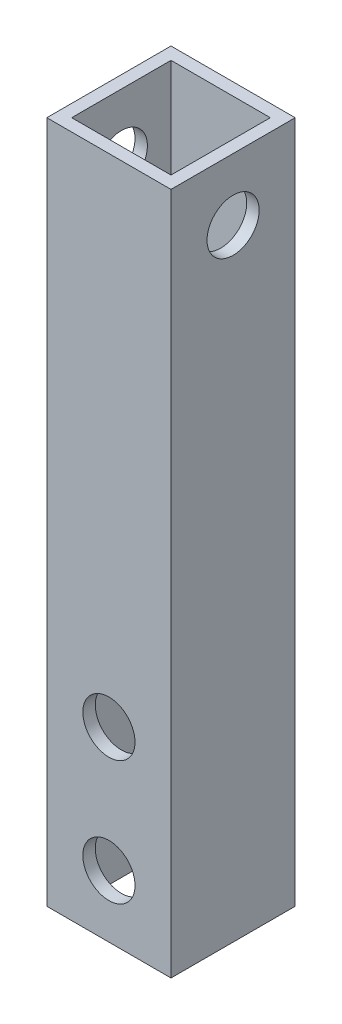
ISO-10303-21;
HEADER;
FILE_DESCRIPTION(('STEP AP214'),'2;1');
FILE_NAME('part.step','',(''),(''),'','','');
FILE_SCHEMA(('AUTOMOTIVE_DESIGN { 1 0 10303 214 1 1 1 1 }'));
ENDSEC;
DATA;
#1=APPLICATION_CONTEXT('core data for automotive mechanical design processes');
#2=APPLICATION_PROTOCOL_DEFINITION('international standard','automotive_design',2000,#1);
#3=PRODUCT_CONTEXT('',#1,'mechanical');
#4=PRODUCT('Part','Part','',(#3));
#5=PRODUCT_RELATED_PRODUCT_CATEGORY('part','',(#4));
#6=PRODUCT_DEFINITION_FORMATION('','',#4);
#7=PRODUCT_DEFINITION_CONTEXT('part definition',#1,'design');
#8=PRODUCT_DEFINITION('design','',#6,#7);
#9=PRODUCT_DEFINITION_SHAPE('','',#8);
#10=(LENGTH_UNIT() NAMED_UNIT(*) SI_UNIT(.MILLI.,.METRE.));
#11=(NAMED_UNIT(*) PLANE_ANGLE_UNIT() SI_UNIT($,.RADIAN.));
#12=(NAMED_UNIT(*) SI_UNIT($,.STERADIAN.) SOLID_ANGLE_UNIT());
#13=UNCERTAINTY_MEASURE_WITH_UNIT(LENGTH_MEASURE(1.E-05),#10,'distance_accuracy_value','');
#14=(GEOMETRIC_REPRESENTATION_CONTEXT(3) GLOBAL_UNCERTAINTY_ASSIGNED_CONTEXT((#13)) GLOBAL_UNIT_ASSIGNED_CONTEXT((#10,
#11,#12)) REPRESENTATION_CONTEXT('',''));
#15=CARTESIAN_POINT('',(0.,0.,0.));
#16=DIRECTION('',(0.,0.,1.));
#17=DIRECTION('',(1.,0.,0.));
#18=AXIS2_PLACEMENT_3D('',#15,#16,#17);
#19=CARTESIAN_POINT('',(0.,55.,0.));
#20=DIRECTION('',(0.,1.,0.));
#21=DIRECTION('',(0.,0.,1.));
#22=AXIS2_PLACEMENT_3D('',#19,#20,#21);
#23=PLANE('',#22);
#24=DIRECTION('',(0.,0.,-1.));
#25=VECTOR('',#24,1.);
#26=CARTESIAN_POINT('',(5.,55.,-5.));
#27=LINE('',#26,#25);
#28=CARTESIAN_POINT('',(5.,55.,5.));
#29=VERTEX_POINT('',#28);
#30=CARTESIAN_POINT('',(5.,55.,-5.));
#31=VERTEX_POINT('',#30);
#32=EDGE_CURVE('E164',#29,#31,#27,.T.);
#33=ORIENTED_EDGE('',*,*,#32,.T.);
#34=DIRECTION('',(-1.,0.,0.));
#35=VECTOR('',#34,1.);
#36=CARTESIAN_POINT('',(-5.,55.,-5.));
#37=LINE('',#36,#35);
#38=CARTESIAN_POINT('',(-5.,55.,-5.));
#39=VERTEX_POINT('',#38);
#40=EDGE_CURVE('E167',#31,#39,#37,.T.);
#41=ORIENTED_EDGE('',*,*,#40,.T.);
#42=DIRECTION('',(0.,0.,1.));
#43=VECTOR('',#42,1.);
#44=CARTESIAN_POINT('',(-5.,55.,-5.));
#45=LINE('',#44,#43);
#46=CARTESIAN_POINT('',(-5.,55.,5.));
#47=VERTEX_POINT('',#46);
#48=EDGE_CURVE('E170',#39,#47,#45,.T.);
#49=ORIENTED_EDGE('',*,*,#48,.T.);
#50=DIRECTION('',(1.,0.,0.));
#51=VECTOR('',#50,1.);
#52=CARTESIAN_POINT('',(-5.,55.,5.));
#53=LINE('',#52,#51);
#54=EDGE_CURVE('E172',#47,#29,#53,.T.);
#55=ORIENTED_EDGE('',*,*,#54,.T.);
#56=EDGE_LOOP('',(#33,#41,#49,#55));
#57=FACE_BOUND('',#56,.T.);
#58=DIRECTION('',(-1.,0.,0.));
#59=VECTOR('',#58,1.);
#60=CARTESIAN_POINT('',(-5.,55.,-4.));
#61=LINE('',#60,#59);
#62=CARTESIAN_POINT('',(4.,55.,-4.));
#63=VERTEX_POINT('',#62);
#64=CARTESIAN_POINT('',(-4.,55.,-4.));
#65=VERTEX_POINT('',#64);
#66=EDGE_CURVE('E134',#63,#65,#61,.T.);
#67=ORIENTED_EDGE('',*,*,#66,.F.);
#68=DIRECTION('',(0.,0.,-1.));
#69=VECTOR('',#68,1.);
#70=CARTESIAN_POINT('',(4.,55.,-5.));
#71=LINE('',#70,#69);
#72=CARTESIAN_POINT('',(4.,55.,4.));
#73=VERTEX_POINT('',#72);
#74=EDGE_CURVE('E126',#73,#63,#71,.T.);
#75=ORIENTED_EDGE('',*,*,#74,.F.);
#76=DIRECTION('',(1.,0.,0.));
#77=VECTOR('',#76,1.);
#78=CARTESIAN_POINT('',(-5.,55.,4.));
#79=LINE('',#78,#77);
#80=CARTESIAN_POINT('',(-4.,55.,4.));
#81=VERTEX_POINT('',#80);
#82=EDGE_CURVE('E148',#81,#73,#79,.T.);
#83=ORIENTED_EDGE('',*,*,#82,.F.);
#84=DIRECTION('',(0.,0.,1.));
#85=VECTOR('',#84,1.);
#86=CARTESIAN_POINT('',(-4.,55.,-5.));
#87=LINE('',#86,#85);
#88=EDGE_CURVE('E146',#65,#81,#87,.T.);
#89=ORIENTED_EDGE('',*,*,#88,.F.);
#90=EDGE_LOOP('',(#67,#75,#83,#89));
#91=FACE_BOUND('',#90,.T.);
#92=ADVANCED_FACE('F59',(#57,#91),#23,.T.);
#93=CARTESIAN_POINT('',(0.,0.,0.));
#94=DIRECTION('',(0.,1.,0.));
#95=DIRECTION('',(0.,0.,1.));
#96=AXIS2_PLACEMENT_3D('',#93,#94,#95);
#97=PLANE('',#96);
#98=DIRECTION('',(0.,0.,-1.));
#99=VECTOR('',#98,1.);
#100=CARTESIAN_POINT('',(5.,0.,-5.));
#101=LINE('',#100,#99);
#102=CARTESIAN_POINT('',(5.,0.,5.));
#103=VERTEX_POINT('',#102);
#104=CARTESIAN_POINT('',(5.,0.,-5.));
#105=VERTEX_POINT('',#104);
#106=EDGE_CURVE('E142',#103,#105,#101,.T.);
#107=ORIENTED_EDGE('',*,*,#106,.F.);
#108=DIRECTION('',(1.,0.,0.));
#109=VECTOR('',#108,1.);
#110=CARTESIAN_POINT('',(-5.,0.,5.));
#111=LINE('',#110,#109);
#112=CARTESIAN_POINT('',(-5.,0.,5.));
#113=VERTEX_POINT('',#112);
#114=EDGE_CURVE('E168',#113,#103,#111,.T.);
#115=ORIENTED_EDGE('',*,*,#114,.F.);
#116=DIRECTION('',(0.,0.,1.));
#117=VECTOR('',#116,1.);
#118=CARTESIAN_POINT('',(-5.,0.,-5.));
#119=LINE('',#118,#117);
#120=CARTESIAN_POINT('',(-5.,0.,-5.));
#121=VERTEX_POINT('',#120);
#122=EDGE_CURVE('E179',#121,#113,#119,.T.);
#123=ORIENTED_EDGE('',*,*,#122,.F.);
#124=DIRECTION('',(-1.,0.,0.));
#125=VECTOR('',#124,1.);
#126=CARTESIAN_POINT('',(-5.,0.,-5.));
#127=LINE('',#126,#125);
#128=EDGE_CURVE('E177',#105,#121,#127,.T.);
#129=ORIENTED_EDGE('',*,*,#128,.F.);
#130=EDGE_LOOP('',(#107,#115,#123,#129));
#131=FACE_BOUND('',#130,.T.);
#132=DIRECTION('',(0.,0.,-1.));
#133=VECTOR('',#132,1.);
#134=CARTESIAN_POINT('',(4.,0.,-5.));
#135=LINE('',#134,#133);
#136=CARTESIAN_POINT('',(4.,0.,4.));
#137=VERTEX_POINT('',#136);
#138=CARTESIAN_POINT('',(4.,0.,-4.));
#139=VERTEX_POINT('',#138);
#140=EDGE_CURVE('E84',#137,#139,#135,.T.);
#141=ORIENTED_EDGE('',*,*,#140,.T.);
#142=DIRECTION('',(-1.,0.,0.));
#143=VECTOR('',#142,1.);
#144=CARTESIAN_POINT('',(-5.,0.,-4.));
#145=LINE('',#144,#143);
#146=CARTESIAN_POINT('',(-4.,0.,-4.));
#147=VERTEX_POINT('',#146);
#148=EDGE_CURVE('E141',#139,#147,#145,.T.);
#149=ORIENTED_EDGE('',*,*,#148,.T.);
#150=DIRECTION('',(0.,0.,1.));
#151=VECTOR('',#150,1.);
#152=CARTESIAN_POINT('',(-4.,0.,-5.));
#153=LINE('',#152,#151);
#154=CARTESIAN_POINT('',(-4.,0.,4.));
#155=VERTEX_POINT('',#154);
#156=EDGE_CURVE('E156',#147,#155,#153,.T.);
#157=ORIENTED_EDGE('',*,*,#156,.T.);
#158=DIRECTION('',(1.,0.,0.));
#159=VECTOR('',#158,1.);
#160=CARTESIAN_POINT('',(-5.,0.,4.));
#161=LINE('',#160,#159);
#162=EDGE_CURVE('E135',#155,#137,#161,.T.);
#163=ORIENTED_EDGE('',*,*,#162,.T.);
#164=EDGE_LOOP('',(#141,#149,#157,#163));
#165=FACE_BOUND('',#164,.T.);
#166=ADVANCED_FACE('F237',(#131,#165),#97,.F.);
#167=CARTESIAN_POINT('',(5.,55.,-5.));
#168=DIRECTION('',(-1.,0.,0.));
#169=DIRECTION('',(0.,0.,1.));
#170=AXIS2_PLACEMENT_3D('',#167,#168,#169);
#171=PLANE('',#170);
#172=CARTESIAN_POINT('',(5.,50.,0.));
#173=DIRECTION('',(1.,0.,0.));
#174=DIRECTION('',(0.,0.,-1.));
#175=AXIS2_PLACEMENT_3D('',#172,#173,#174);
#176=CIRCLE('',#175,2.1);
#177=CARTESIAN_POINT('',(5.,50.,-2.1));
#178=VERTEX_POINT('',#177);
#179=EDGE_CURVE('E217',#178,#178,#176,.T.);
#180=ORIENTED_EDGE('',*,*,#179,.F.);
#181=EDGE_LOOP('',(#180));
#182=FACE_BOUND('',#181,.T.);
#183=ORIENTED_EDGE('',*,*,#106,.T.);
#184=DIRECTION('',(0.,-1.,0.));
#185=VECTOR('',#184,1.);
#186=CARTESIAN_POINT('',(5.,55.,-5.));
#187=LINE('',#186,#185);
#188=EDGE_CURVE('E12',#31,#105,#187,.T.);
#189=ORIENTED_EDGE('',*,*,#188,.F.);
#190=ORIENTED_EDGE('',*,*,#32,.F.);
#191=DIRECTION('',(0.,-1.,0.));
#192=VECTOR('',#191,1.);
#193=CARTESIAN_POINT('',(5.,55.,5.));
#194=LINE('',#193,#192);
#195=EDGE_CURVE('E174',#29,#103,#194,.T.);
#196=ORIENTED_EDGE('',*,*,#195,.T.);
#197=EDGE_LOOP('',(#183,#189,#190,#196));
#198=FACE_BOUND('',#197,.T.);
#199=ADVANCED_FACE('F61',(#182,#198),#171,.F.);
#200=CARTESIAN_POINT('',(-5.,55.,-5.));
#201=DIRECTION('',(0.,0.,1.));
#202=DIRECTION('',(1.,0.,0.));
#203=AXIS2_PLACEMENT_3D('',#200,#201,#202);
#204=PLANE('',#203);
#205=CARTESIAN_POINT('',(0.,15.,-5.));
#206=DIRECTION('',(0.,0.,1.));
#207=DIRECTION('',(1.,0.,0.));
#208=AXIS2_PLACEMENT_3D('',#205,#206,#207);
#209=CIRCLE('',#208,2.1);
#210=CARTESIAN_POINT('',(2.1,15.,-5.));
#211=VERTEX_POINT('',#210);
#212=EDGE_CURVE('E192',#211,#211,#209,.T.);
#213=ORIENTED_EDGE('',*,*,#212,.T.);
#214=EDGE_LOOP('',(#213));
#215=FACE_BOUND('',#214,.T.);
#216=CARTESIAN_POINT('',(0.,5.,-5.));
#217=DIRECTION('',(0.,0.,1.));
#218=DIRECTION('',(1.,0.,0.));
#219=AXIS2_PLACEMENT_3D('',#216,#217,#218);
#220=CIRCLE('',#219,2.1);
#221=CARTESIAN_POINT('',(2.1,5.,-5.));
#222=VERTEX_POINT('',#221);
#223=EDGE_CURVE('E206',#222,#222,#220,.T.);
#224=ORIENTED_EDGE('',*,*,#223,.T.);
#225=EDGE_LOOP('',(#224));
#226=FACE_BOUND('',#225,.T.);
#227=ORIENTED_EDGE('',*,*,#128,.T.);
#228=DIRECTION('',(0.,-1.,0.));
#229=VECTOR('',#228,1.);
#230=CARTESIAN_POINT('',(-5.,55.,-5.));
#231=LINE('',#230,#229);
#232=EDGE_CURVE('E68',#39,#121,#231,.T.);
#233=ORIENTED_EDGE('',*,*,#232,.F.);
#234=ORIENTED_EDGE('',*,*,#40,.F.);
#235=ORIENTED_EDGE('',*,*,#188,.T.);
#236=EDGE_LOOP('',(#227,#233,#234,#235));
#237=FACE_BOUND('',#236,.T.);
#238=ADVANCED_FACE('F267',(#215,#226,#237),#204,.F.);
#239=CARTESIAN_POINT('',(-5.,55.,-5.));
#240=DIRECTION('',(1.,0.,0.));
#241=DIRECTION('',(0.,0.,-1.));
#242=AXIS2_PLACEMENT_3D('',#239,#240,#241);
#243=PLANE('',#242);
#244=CARTESIAN_POINT('',(-5.,50.,0.));
#245=DIRECTION('',(1.,0.,0.));
#246=DIRECTION('',(0.,0.,-1.));
#247=AXIS2_PLACEMENT_3D('',#244,#245,#246);
#248=CIRCLE('',#247,2.1);
#249=CARTESIAN_POINT('',(-5.,50.,-2.1));
#250=VERTEX_POINT('',#249);
#251=EDGE_CURVE('E220',#250,#250,#248,.T.);
#252=ORIENTED_EDGE('',*,*,#251,.T.);
#253=EDGE_LOOP('',(#252));
#254=FACE_BOUND('',#253,.T.);
#255=ORIENTED_EDGE('',*,*,#122,.T.);
#256=DIRECTION('',(0.,-1.,0.));
#257=VECTOR('',#256,1.);
#258=CARTESIAN_POINT('',(-5.,55.,5.));
#259=LINE('',#258,#257);
#260=EDGE_CURVE('E184',#47,#113,#259,.T.);
#261=ORIENTED_EDGE('',*,*,#260,.F.);
#262=ORIENTED_EDGE('',*,*,#48,.F.);
#263=ORIENTED_EDGE('',*,*,#232,.T.);
#264=EDGE_LOOP('',(#255,#261,#262,#263));
#265=FACE_BOUND('',#264,.T.);
#266=ADVANCED_FACE('F264',(#254,#265),#243,.F.);
#267=CARTESIAN_POINT('',(-5.,55.,5.));
#268=DIRECTION('',(0.,0.,-1.));
#269=DIRECTION('',(-1.,0.,0.));
#270=AXIS2_PLACEMENT_3D('',#267,#268,#269);
#271=PLANE('',#270);
#272=CARTESIAN_POINT('',(0.,15.,5.));
#273=DIRECTION('',(0.,0.,1.));
#274=DIRECTION('',(1.,0.,0.));
#275=AXIS2_PLACEMENT_3D('',#272,#273,#274);
#276=CIRCLE('',#275,2.1);
#277=CARTESIAN_POINT('',(2.1,15.,5.));
#278=VERTEX_POINT('',#277);
#279=EDGE_CURVE('E210',#278,#278,#276,.T.);
#280=ORIENTED_EDGE('',*,*,#279,.F.);
#281=EDGE_LOOP('',(#280));
#282=FACE_BOUND('',#281,.T.);
#283=CARTESIAN_POINT('',(0.,5.,5.));
#284=DIRECTION('',(0.,0.,1.));
#285=DIRECTION('',(1.,0.,0.));
#286=AXIS2_PLACEMENT_3D('',#283,#284,#285);
#287=CIRCLE('',#286,2.1);
#288=CARTESIAN_POINT('',(2.1,5.,5.));
#289=VERTEX_POINT('',#288);
#290=EDGE_CURVE('E203',#289,#289,#287,.T.);
#291=ORIENTED_EDGE('',*,*,#290,.F.);
#292=EDGE_LOOP('',(#291));
#293=FACE_BOUND('',#292,.T.);
#294=ORIENTED_EDGE('',*,*,#114,.T.);
#295=ORIENTED_EDGE('',*,*,#195,.F.);
#296=ORIENTED_EDGE('',*,*,#54,.F.);
#297=ORIENTED_EDGE('',*,*,#260,.T.);
#298=EDGE_LOOP('',(#294,#295,#296,#297));
#299=FACE_BOUND('',#298,.T.);
#300=ADVANCED_FACE('F261',(#282,#293,#299),#271,.F.);
#301=CARTESIAN_POINT('',(4.,55.,-5.));
#302=DIRECTION('',(-1.,0.,0.));
#303=DIRECTION('',(0.,0.,1.));
#304=AXIS2_PLACEMENT_3D('',#301,#302,#303);
#305=PLANE('',#304);
#306=CARTESIAN_POINT('',(4.,50.,0.));
#307=DIRECTION('',(-1.,0.,0.));
#308=DIRECTION('',(0.,0.,1.));
#309=AXIS2_PLACEMENT_3D('',#306,#307,#308);
#310=CIRCLE('',#309,2.1);
#311=CARTESIAN_POINT('',(4.,50.,2.1));
#312=VERTEX_POINT('',#311);
#313=EDGE_CURVE('E207',#312,#312,#310,.T.);
#314=ORIENTED_EDGE('',*,*,#313,.F.);
#315=EDGE_LOOP('',(#314));
#316=FACE_BOUND('',#315,.T.);
#317=ORIENTED_EDGE('',*,*,#140,.F.);
#318=DIRECTION('',(0.,-1.,0.));
#319=VECTOR('',#318,1.);
#320=CARTESIAN_POINT('',(4.,55.,4.));
#321=LINE('',#320,#319);
#322=EDGE_CURVE('E130',#73,#137,#321,.T.);
#323=ORIENTED_EDGE('',*,*,#322,.F.);
#324=ORIENTED_EDGE('',*,*,#74,.T.);
#325=DIRECTION('',(0.,-1.,0.));
#326=VECTOR('',#325,1.);
#327=CARTESIAN_POINT('',(4.,55.,-4.));
#328=LINE('',#327,#326);
#329=EDGE_CURVE('E129',#63,#139,#328,.T.);
#330=ORIENTED_EDGE('',*,*,#329,.T.);
#331=EDGE_LOOP('',(#317,#323,#324,#330));
#332=FACE_BOUND('',#331,.T.);
#333=ADVANCED_FACE('F128',(#316,#332),#305,.T.);
#334=CARTESIAN_POINT('',(-5.,55.,-4.));
#335=DIRECTION('',(0.,0.,1.));
#336=DIRECTION('',(1.,0.,0.));
#337=AXIS2_PLACEMENT_3D('',#334,#335,#336);
#338=PLANE('',#337);
#339=CARTESIAN_POINT('',(0.,15.,-4.));
#340=DIRECTION('',(0.,0.,1.));
#341=DIRECTION('',(1.,0.,0.));
#342=AXIS2_PLACEMENT_3D('',#339,#340,#341);
#343=CIRCLE('',#342,2.1);
#344=CARTESIAN_POINT('',(2.1,15.,-4.));
#345=VERTEX_POINT('',#344);
#346=EDGE_CURVE('E154',#345,#345,#343,.T.);
#347=ORIENTED_EDGE('',*,*,#346,.F.);
#348=EDGE_LOOP('',(#347));
#349=FACE_BOUND('',#348,.T.);
#350=CARTESIAN_POINT('',(0.,5.,-4.));
#351=DIRECTION('',(0.,0.,1.));
#352=DIRECTION('',(1.,0.,0.));
#353=AXIS2_PLACEMENT_3D('',#350,#351,#352);
#354=CIRCLE('',#353,2.1);
#355=CARTESIAN_POINT('',(2.1,5.,-4.));
#356=VERTEX_POINT('',#355);
#357=EDGE_CURVE('E191',#356,#356,#354,.T.);
#358=ORIENTED_EDGE('',*,*,#357,.F.);
#359=EDGE_LOOP('',(#358));
#360=FACE_BOUND('',#359,.T.);
#361=ORIENTED_EDGE('',*,*,#148,.F.);
#362=ORIENTED_EDGE('',*,*,#329,.F.);
#363=ORIENTED_EDGE('',*,*,#66,.T.);
#364=DIRECTION('',(0.,-1.,0.));
#365=VECTOR('',#364,1.);
#366=CARTESIAN_POINT('',(-4.,55.,-4.));
#367=LINE('',#366,#365);
#368=EDGE_CURVE('E143',#65,#147,#367,.T.);
#369=ORIENTED_EDGE('',*,*,#368,.T.);
#370=EDGE_LOOP('',(#361,#362,#363,#369));
#371=FACE_BOUND('',#370,.T.);
#372=ADVANCED_FACE('F138',(#349,#360,#371),#338,.T.);
#373=CARTESIAN_POINT('',(-4.,55.,-5.));
#374=DIRECTION('',(1.,0.,0.));
#375=DIRECTION('',(0.,0.,-1.));
#376=AXIS2_PLACEMENT_3D('',#373,#374,#375);
#377=PLANE('',#376);
#378=CARTESIAN_POINT('',(-4.,50.,0.));
#379=DIRECTION('',(1.,0.,0.));
#380=DIRECTION('',(0.,0.,-1.));
#381=AXIS2_PLACEMENT_3D('',#378,#379,#380);
#382=CIRCLE('',#381,2.1);
#383=CARTESIAN_POINT('',(-4.,50.,-2.1));
#384=VERTEX_POINT('',#383);
#385=EDGE_CURVE('E63',#384,#384,#382,.T.);
#386=ORIENTED_EDGE('',*,*,#385,.F.);
#387=EDGE_LOOP('',(#386));
#388=FACE_BOUND('',#387,.T.);
#389=ORIENTED_EDGE('',*,*,#156,.F.);
#390=ORIENTED_EDGE('',*,*,#368,.F.);
#391=ORIENTED_EDGE('',*,*,#88,.T.);
#392=DIRECTION('',(0.,-1.,0.));
#393=VECTOR('',#392,1.);
#394=CARTESIAN_POINT('',(-4.,55.,4.));
#395=LINE('',#394,#393);
#396=EDGE_CURVE('E76',#81,#155,#395,.T.);
#397=ORIENTED_EDGE('',*,*,#396,.T.);
#398=EDGE_LOOP('',(#389,#390,#391,#397));
#399=FACE_BOUND('',#398,.T.);
#400=ADVANCED_FACE('F230',(#388,#399),#377,.T.);
#401=CARTESIAN_POINT('',(-5.,55.,4.));
#402=DIRECTION('',(0.,0.,-1.));
#403=DIRECTION('',(-1.,0.,0.));
#404=AXIS2_PLACEMENT_3D('',#401,#402,#403);
#405=PLANE('',#404);
#406=CARTESIAN_POINT('',(0.,15.,4.));
#407=DIRECTION('',(0.,0.,-1.));
#408=DIRECTION('',(-1.,0.,0.));
#409=AXIS2_PLACEMENT_3D('',#406,#407,#408);
#410=CIRCLE('',#409,2.1);
#411=CARTESIAN_POINT('',(-2.1,15.,4.));
#412=VERTEX_POINT('',#411);
#413=EDGE_CURVE('E193',#412,#412,#410,.T.);
#414=ORIENTED_EDGE('',*,*,#413,.F.);
#415=EDGE_LOOP('',(#414));
#416=FACE_BOUND('',#415,.T.);
#417=CARTESIAN_POINT('',(0.,5.,4.));
#418=DIRECTION('',(0.,0.,-1.));
#419=DIRECTION('',(-1.,0.,0.));
#420=AXIS2_PLACEMENT_3D('',#417,#418,#419);
#421=CIRCLE('',#420,2.1);
#422=CARTESIAN_POINT('',(-2.1,5.,4.));
#423=VERTEX_POINT('',#422);
#424=EDGE_CURVE('E189',#423,#423,#421,.T.);
#425=ORIENTED_EDGE('',*,*,#424,.F.);
#426=EDGE_LOOP('',(#425));
#427=FACE_BOUND('',#426,.T.);
#428=ORIENTED_EDGE('',*,*,#162,.F.);
#429=ORIENTED_EDGE('',*,*,#396,.F.);
#430=ORIENTED_EDGE('',*,*,#82,.T.);
#431=ORIENTED_EDGE('',*,*,#322,.T.);
#432=EDGE_LOOP('',(#428,#429,#430,#431));
#433=FACE_BOUND('',#432,.T.);
#434=ADVANCED_FACE('F233',(#416,#427,#433),#405,.T.);
#435=CARTESIAN_POINT('',(0.,5.,-5.));
#436=DIRECTION('',(0.,0.,1.));
#437=DIRECTION('',(1.,0.,0.));
#438=AXIS2_PLACEMENT_3D('',#435,#436,#437);
#439=CYLINDRICAL_SURFACE('',#438,2.1);
#440=ORIENTED_EDGE('',*,*,#424,.T.);
#441=EDGE_LOOP('',(#440));
#442=FACE_BOUND('',#441,.T.);
#443=ORIENTED_EDGE('',*,*,#290,.T.);
#444=EDGE_LOOP('',(#443));
#445=FACE_BOUND('',#444,.T.);
#446=ADVANCED_FACE('F239',(#442,#445),#439,.F.);
#447=CARTESIAN_POINT('',(0.,15.,-5.));
#448=DIRECTION('',(0.,0.,1.));
#449=DIRECTION('',(1.,0.,0.));
#450=AXIS2_PLACEMENT_3D('',#447,#448,#449);
#451=CYLINDRICAL_SURFACE('',#450,2.1);
#452=ORIENTED_EDGE('',*,*,#413,.T.);
#453=EDGE_LOOP('',(#452));
#454=FACE_BOUND('',#453,.T.);
#455=ORIENTED_EDGE('',*,*,#279,.T.);
#456=EDGE_LOOP('',(#455));
#457=FACE_BOUND('',#456,.T.);
#458=ADVANCED_FACE('F245',(#454,#457),#451,.F.);
#459=ORIENTED_EDGE('',*,*,#357,.T.);
#460=EDGE_LOOP('',(#459));
#461=FACE_BOUND('',#460,.T.);
#462=ORIENTED_EDGE('',*,*,#223,.F.);
#463=EDGE_LOOP('',(#462));
#464=FACE_BOUND('',#463,.T.);
#465=ADVANCED_FACE('F248',(#461,#464),#439,.F.);
#466=ORIENTED_EDGE('',*,*,#346,.T.);
#467=EDGE_LOOP('',(#466));
#468=FACE_BOUND('',#467,.T.);
#469=ORIENTED_EDGE('',*,*,#212,.F.);
#470=EDGE_LOOP('',(#469));
#471=FACE_BOUND('',#470,.T.);
#472=ADVANCED_FACE('F293',(#468,#471),#451,.F.);
#473=CARTESIAN_POINT('',(-5.,50.,0.));
#474=DIRECTION('',(1.,0.,0.));
#475=DIRECTION('',(0.,0.,-1.));
#476=AXIS2_PLACEMENT_3D('',#473,#474,#475);
#477=CYLINDRICAL_SURFACE('',#476,2.1);
#478=ORIENTED_EDGE('',*,*,#385,.T.);
#479=EDGE_LOOP('',(#478));
#480=FACE_BOUND('',#479,.T.);
#481=ORIENTED_EDGE('',*,*,#251,.F.);
#482=EDGE_LOOP('',(#481));
#483=FACE_BOUND('',#482,.T.);
#484=ADVANCED_FACE('F227',(#480,#483),#477,.F.);
#485=ORIENTED_EDGE('',*,*,#313,.T.);
#486=EDGE_LOOP('',(#485));
#487=FACE_BOUND('',#486,.T.);
#488=ORIENTED_EDGE('',*,*,#179,.T.);
#489=EDGE_LOOP('',(#488));
#490=FACE_BOUND('',#489,.T.);
#491=ADVANCED_FACE('F302',(#487,#490),#477,.F.);
#492=CLOSED_SHELL('',(#92,#166,#199,#238,#266,#300,#333,#372,#400,#434,#446,#458,#465,#472,#484,#491));
#493=MANIFOLD_SOLID_BREP('B2',#492);
#494=ADVANCED_BREP_SHAPE_REPRESENTATION('',(#18,#493),#14);
#495=SHAPE_DEFINITION_REPRESENTATION(#9,#494);
ENDSEC;
END-ISO-10303-21;
